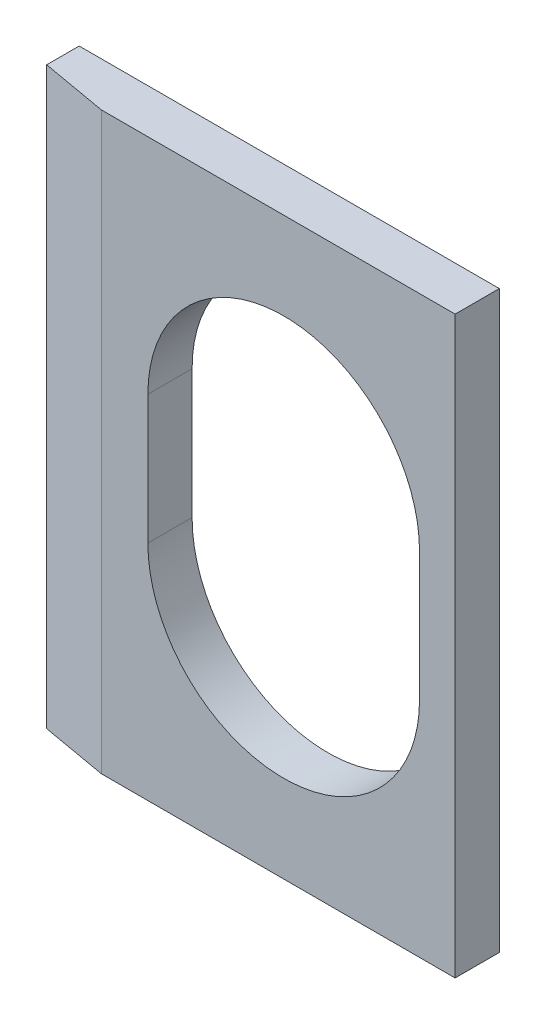
ISO-10303-21;
HEADER;
FILE_DESCRIPTION(('STEP AP214'),'2;1');
FILE_NAME('part.step','',(''),(''),'','','');
FILE_SCHEMA(('AUTOMOTIVE_DESIGN { 1 0 10303 214 1 1 1 1 }'));
ENDSEC;
DATA;
#1=APPLICATION_CONTEXT('core data for automotive mechanical design processes');
#2=APPLICATION_PROTOCOL_DEFINITION('international standard','automotive_design',2000,#1);
#3=PRODUCT_CONTEXT('',#1,'mechanical');
#4=PRODUCT('Part','Part','',(#3));
#5=PRODUCT_RELATED_PRODUCT_CATEGORY('part','',(#4));
#6=PRODUCT_DEFINITION_FORMATION('','',#4);
#7=PRODUCT_DEFINITION_CONTEXT('part definition',#1,'design');
#8=PRODUCT_DEFINITION('design','',#6,#7);
#9=PRODUCT_DEFINITION_SHAPE('','',#8);
#10=(LENGTH_UNIT() NAMED_UNIT(*) SI_UNIT(.MILLI.,.METRE.));
#11=(NAMED_UNIT(*) PLANE_ANGLE_UNIT() SI_UNIT($,.RADIAN.));
#12=(NAMED_UNIT(*) SI_UNIT($,.STERADIAN.) SOLID_ANGLE_UNIT());
#13=UNCERTAINTY_MEASURE_WITH_UNIT(LENGTH_MEASURE(1.E-05),#10,'distance_accuracy_value','');
#14=(GEOMETRIC_REPRESENTATION_CONTEXT(3) GLOBAL_UNCERTAINTY_ASSIGNED_CONTEXT((#13)) GLOBAL_UNIT_ASSIGNED_CONTEXT((#10,
#11,#12)) REPRESENTATION_CONTEXT('',''));
#15=CARTESIAN_POINT('',(0.,0.,0.));
#16=DIRECTION('',(0.,0.,1.));
#17=DIRECTION('',(1.,0.,0.));
#18=AXIS2_PLACEMENT_3D('',#15,#16,#17);
#19=CARTESIAN_POINT('',(60.325,-82.55,12.7));
#20=DIRECTION('',(-1.,0.,0.));
#21=DIRECTION('',(0.,0.,1.));
#22=AXIS2_PLACEMENT_3D('',#19,#20,#21);
#23=PLANE('',#22);
#24=DIRECTION('',(0.,1.,0.));
#25=VECTOR('',#24,1.);
#26=CARTESIAN_POINT('',(60.325,-82.55,0.));
#27=LINE('',#26,#25);
#28=CARTESIAN_POINT('',(60.325,-82.55,0.));
#29=VERTEX_POINT('',#28);
#30=CARTESIAN_POINT('',(60.325,82.55,0.));
#31=VERTEX_POINT('',#30);
#32=EDGE_CURVE('E128',#29,#31,#27,.T.);
#33=ORIENTED_EDGE('',*,*,#32,.T.);
#34=DIRECTION('',(0.,0.,-1.));
#35=VECTOR('',#34,1.);
#36=CARTESIAN_POINT('',(60.325,82.55,12.7));
#37=LINE('',#36,#35);
#38=CARTESIAN_POINT('',(60.325,82.55,12.7));
#39=VERTEX_POINT('',#38);
#40=EDGE_CURVE('E11',#39,#31,#37,.T.);
#41=ORIENTED_EDGE('',*,*,#40,.F.);
#42=DIRECTION('',(0.,1.,0.));
#43=VECTOR('',#42,1.);
#44=CARTESIAN_POINT('',(60.325,-82.55,12.7));
#45=LINE('',#44,#43);
#46=CARTESIAN_POINT('',(60.325,-82.55,12.7));
#47=VERTEX_POINT('',#46);
#48=EDGE_CURVE('E118',#47,#39,#45,.T.);
#49=ORIENTED_EDGE('',*,*,#48,.F.);
#50=DIRECTION('',(0.,0.,-1.));
#51=VECTOR('',#50,1.);
#52=CARTESIAN_POINT('',(60.325,-82.55,12.7));
#53=LINE('',#52,#51);
#54=EDGE_CURVE('E122',#47,#29,#53,.T.);
#55=ORIENTED_EDGE('',*,*,#54,.T.);
#56=EDGE_LOOP('',(#33,#41,#49,#55));
#57=FACE_BOUND('',#56,.T.);
#58=ADVANCED_FACE('F31',(#57),#23,.F.);
#59=CARTESIAN_POINT('',(-60.325,82.55,12.7));
#60=DIRECTION('',(0.,-1.,0.));
#61=DIRECTION('',(0.,0.,-1.));
#62=AXIS2_PLACEMENT_3D('',#59,#60,#61);
#63=PLANE('',#62);
#64=DIRECTION('',(0.,0.,-1.));
#65=VECTOR('',#64,1.);
#66=CARTESIAN_POINT('',(-60.325,82.55,12.7));
#67=LINE('',#66,#65);
#68=CARTESIAN_POINT('',(-60.325,82.55,9.34118215504656));
#69=VERTEX_POINT('',#68);
#70=CARTESIAN_POINT('',(-60.325,82.55,0.));
#71=VERTEX_POINT('',#70);
#72=EDGE_CURVE('E38',#69,#71,#67,.T.);
#73=ORIENTED_EDGE('',*,*,#72,.F.);
#74=DIRECTION('',(-0.984807753012209,0.,-0.173648177666923));
#75=VECTOR('',#74,1.);
#76=CARTESIAN_POINT('',(-41.2761974205072,82.55,12.7));
#77=LINE('',#76,#75);
#78=CARTESIAN_POINT('',(-41.2761974205072,82.55,12.7));
#79=VERTEX_POINT('',#78);
#80=EDGE_CURVE('E102',#79,#69,#77,.T.);
#81=ORIENTED_EDGE('',*,*,#80,.F.);
#82=DIRECTION('',(-1.,0.,0.));
#83=VECTOR('',#82,1.);
#84=CARTESIAN_POINT('',(-60.325,82.55,12.7));
#85=LINE('',#84,#83);
#86=EDGE_CURVE('E112',#39,#79,#85,.T.);
#87=ORIENTED_EDGE('',*,*,#86,.F.);
#88=ORIENTED_EDGE('',*,*,#40,.T.);
#89=DIRECTION('',(-1.,0.,0.));
#90=VECTOR('',#89,1.);
#91=CARTESIAN_POINT('',(-60.325,82.55,0.));
#92=LINE('',#91,#90);
#93=EDGE_CURVE('E131',#31,#71,#92,.T.);
#94=ORIENTED_EDGE('',*,*,#93,.T.);
#95=EDGE_LOOP('',(#73,#81,#87,#88,#94));
#96=FACE_BOUND('',#95,.T.);
#97=ADVANCED_FACE('F111',(#96),#63,.F.);
#98=CARTESIAN_POINT('',(-60.325,-82.55,12.7));
#99=DIRECTION('',(1.,0.,0.));
#100=DIRECTION('',(0.,0.,-1.));
#101=AXIS2_PLACEMENT_3D('',#98,#99,#100);
#102=PLANE('',#101);
#103=DIRECTION('',(0.,0.,-1.));
#104=VECTOR('',#103,1.);
#105=CARTESIAN_POINT('',(-60.325,-82.55,12.7));
#106=LINE('',#105,#104);
#107=CARTESIAN_POINT('',(-60.325,-82.55,9.34118215504656));
#108=VERTEX_POINT('',#107);
#109=CARTESIAN_POINT('',(-60.325,-82.55,0.));
#110=VERTEX_POINT('',#109);
#111=EDGE_CURVE('E140',#108,#110,#106,.T.);
#112=ORIENTED_EDGE('',*,*,#111,.F.);
#113=DIRECTION('',(0.,1.,0.));
#114=VECTOR('',#113,1.);
#115=CARTESIAN_POINT('',(-60.325,-82.551,9.34118215504656));
#116=LINE('',#115,#114);
#117=EDGE_CURVE('E107',#108,#69,#116,.T.);
#118=ORIENTED_EDGE('',*,*,#117,.T.);
#119=ORIENTED_EDGE('',*,*,#72,.T.);
#120=DIRECTION('',(0.,-1.,0.));
#121=VECTOR('',#120,1.);
#122=CARTESIAN_POINT('',(-60.325,-82.55,0.));
#123=LINE('',#122,#121);
#124=EDGE_CURVE('E134',#71,#110,#123,.T.);
#125=ORIENTED_EDGE('',*,*,#124,.T.);
#126=EDGE_LOOP('',(#112,#118,#119,#125));
#127=FACE_BOUND('',#126,.T.);
#128=ADVANCED_FACE('F143',(#127),#102,.F.);
#129=CARTESIAN_POINT('',(-60.325,-82.55,12.7));
#130=DIRECTION('',(0.,1.,0.));
#131=DIRECTION('',(0.,0.,1.));
#132=AXIS2_PLACEMENT_3D('',#129,#130,#131);
#133=PLANE('',#132);
#134=DIRECTION('',(1.,0.,0.));
#135=VECTOR('',#134,1.);
#136=CARTESIAN_POINT('',(-60.325,-82.55,12.7));
#137=LINE('',#136,#135);
#138=CARTESIAN_POINT('',(-41.2761974205073,-82.55,12.7));
#139=VERTEX_POINT('',#138);
#140=EDGE_CURVE('E120',#139,#47,#137,.T.);
#141=ORIENTED_EDGE('',*,*,#140,.F.);
#142=DIRECTION('',(0.984807753012209,0.,0.173648177666923));
#143=VECTOR('',#142,1.);
#144=CARTESIAN_POINT('',(-41.2761974205072,-82.55,12.7));
#145=LINE('',#144,#143);
#146=EDGE_CURVE('E45',#108,#139,#145,.T.);
#147=ORIENTED_EDGE('',*,*,#146,.F.);
#148=ORIENTED_EDGE('',*,*,#111,.T.);
#149=DIRECTION('',(1.,0.,0.));
#150=VECTOR('',#149,1.);
#151=CARTESIAN_POINT('',(-60.325,-82.55,0.));
#152=LINE('',#151,#150);
#153=EDGE_CURVE('E124',#110,#29,#152,.T.);
#154=ORIENTED_EDGE('',*,*,#153,.T.);
#155=ORIENTED_EDGE('',*,*,#54,.F.);
#156=EDGE_LOOP('',(#141,#147,#148,#154,#155));
#157=FACE_BOUND('',#156,.T.);
#158=ADVANCED_FACE('F151',(#157),#133,.F.);
#159=CARTESIAN_POINT('',(60.325,82.55,12.7));
#160=DIRECTION('',(0.,0.,-1.));
#161=DIRECTION('',(-1.,0.,0.));
#162=AXIS2_PLACEMENT_3D('',#159,#160,#161);
#163=PLANE('',#162);
#164=DIRECTION('',(0.,-1.,0.));
#165=VECTOR('',#164,1.);
#166=CARTESIAN_POINT('',(-27.9019,18.5039,12.7));
#167=LINE('',#166,#165);
#168=CARTESIAN_POINT('',(-27.9019,18.5039,12.7));
#169=VERTEX_POINT('',#168);
#170=CARTESIAN_POINT('',(-27.9019,-18.5039,12.7));
#171=VERTEX_POINT('',#170);
#172=EDGE_CURVE('E266',#169,#171,#167,.T.);
#173=ORIENTED_EDGE('',*,*,#172,.F.);
#174=CARTESIAN_POINT('',(11.0998,18.5039,12.7));
#175=DIRECTION('',(0.,0.,1.));
#176=DIRECTION('',(1.,0.,0.));
#177=AXIS2_PLACEMENT_3D('',#174,#175,#176);
#178=CIRCLE('',#177,39.0017);
#179=CARTESIAN_POINT('',(50.1015,18.5039,12.7));
#180=VERTEX_POINT('',#179);
#181=EDGE_CURVE('E53',#180,#169,#178,.T.);
#182=ORIENTED_EDGE('',*,*,#181,.F.);
#183=DIRECTION('',(0.,1.,0.));
#184=VECTOR('',#183,1.);
#185=CARTESIAN_POINT('',(50.1015,18.5039,12.7));
#186=LINE('',#185,#184);
#187=CARTESIAN_POINT('',(50.1015,-18.5039,12.7));
#188=VERTEX_POINT('',#187);
#189=EDGE_CURVE('E254',#188,#180,#186,.T.);
#190=ORIENTED_EDGE('',*,*,#189,.F.);
#191=CARTESIAN_POINT('',(11.0998,-18.5039,12.7));
#192=DIRECTION('',(0.,0.,1.));
#193=DIRECTION('',(1.,0.,0.));
#194=AXIS2_PLACEMENT_3D('',#191,#192,#193);
#195=CIRCLE('',#194,39.0017);
#196=EDGE_CURVE('E263',#171,#188,#195,.T.);
#197=ORIENTED_EDGE('',*,*,#196,.F.);
#198=EDGE_LOOP('',(#173,#182,#190,#197));
#199=FACE_BOUND('',#198,.T.);
#200=ORIENTED_EDGE('',*,*,#86,.T.);
#201=DIRECTION('',(0.,1.,0.));
#202=VECTOR('',#201,1.);
#203=CARTESIAN_POINT('',(-41.2761974205072,-82.551,12.7));
#204=LINE('',#203,#202);
#205=EDGE_CURVE('E99',#139,#79,#204,.T.);
#206=ORIENTED_EDGE('',*,*,#205,.F.);
#207=ORIENTED_EDGE('',*,*,#140,.T.);
#208=ORIENTED_EDGE('',*,*,#48,.T.);
#209=EDGE_LOOP('',(#200,#206,#207,#208));
#210=FACE_BOUND('',#209,.T.);
#211=ADVANCED_FACE('F116',(#199,#210),#163,.F.);
#212=CARTESIAN_POINT('',(60.325,82.55,0.));
#213=DIRECTION('',(0.,0.,-1.));
#214=DIRECTION('',(-1.,0.,0.));
#215=AXIS2_PLACEMENT_3D('',#212,#213,#214);
#216=PLANE('',#215);
#217=CARTESIAN_POINT('',(11.0998,18.5039,0.));
#218=DIRECTION('',(0.,0.,-1.));
#219=DIRECTION('',(-1.,0.,0.));
#220=AXIS2_PLACEMENT_3D('',#217,#218,#219);
#221=CIRCLE('',#220,39.0017);
#222=CARTESIAN_POINT('',(50.1015,18.5039,0.));
#223=VERTEX_POINT('',#222);
#224=CARTESIAN_POINT('',(-27.9019,18.5039,0.));
#225=VERTEX_POINT('',#224);
#226=EDGE_CURVE('E277',#223,#225,#221,.F.);
#227=ORIENTED_EDGE('',*,*,#226,.T.);
#228=DIRECTION('',(0.,-1.,0.));
#229=VECTOR('',#228,1.);
#230=CARTESIAN_POINT('',(-27.9019,18.5039,0.));
#231=LINE('',#230,#229);
#232=CARTESIAN_POINT('',(-27.9019,-18.5039,0.));
#233=VERTEX_POINT('',#232);
#234=EDGE_CURVE('E132',#225,#233,#231,.T.);
#235=ORIENTED_EDGE('',*,*,#234,.T.);
#236=CARTESIAN_POINT('',(11.0998,-18.5039,0.));
#237=DIRECTION('',(0.,0.,-1.));
#238=DIRECTION('',(-1.,0.,0.));
#239=AXIS2_PLACEMENT_3D('',#236,#237,#238);
#240=CIRCLE('',#239,39.0017);
#241=CARTESIAN_POINT('',(50.1015,-18.5039,0.));
#242=VERTEX_POINT('',#241);
#243=EDGE_CURVE('E276',#233,#242,#240,.F.);
#244=ORIENTED_EDGE('',*,*,#243,.T.);
#245=DIRECTION('',(0.,1.,0.));
#246=VECTOR('',#245,1.);
#247=CARTESIAN_POINT('',(50.1015,18.5039,0.));
#248=LINE('',#247,#246);
#249=EDGE_CURVE('E256',#242,#223,#248,.T.);
#250=ORIENTED_EDGE('',*,*,#249,.T.);
#251=EDGE_LOOP('',(#227,#235,#244,#250));
#252=FACE_BOUND('',#251,.T.);
#253=ORIENTED_EDGE('',*,*,#32,.F.);
#254=ORIENTED_EDGE('',*,*,#153,.F.);
#255=ORIENTED_EDGE('',*,*,#124,.F.);
#256=ORIENTED_EDGE('',*,*,#93,.F.);
#257=EDGE_LOOP('',(#253,#254,#255,#256));
#258=FACE_BOUND('',#257,.T.);
#259=ADVANCED_FACE('F148',(#252,#258),#216,.T.);
#260=CARTESIAN_POINT('',(11.0998,18.5039,-0.000999999999999265));
#261=DIRECTION('',(0.,0.,1.));
#262=DIRECTION('',(1.,0.,0.));
#263=AXIS2_PLACEMENT_3D('',#260,#261,#262);
#264=CYLINDRICAL_SURFACE('',#263,39.0017);
#265=DIRECTION('',(0.,0.,1.));
#266=VECTOR('',#265,1.);
#267=CARTESIAN_POINT('',(50.1015,18.5039,-0.000999999999999265));
#268=LINE('',#267,#266);
#269=EDGE_CURVE('E259',#223,#180,#268,.T.);
#270=ORIENTED_EDGE('',*,*,#269,.T.);
#271=ORIENTED_EDGE('',*,*,#181,.T.);
#272=DIRECTION('',(0.,0.,1.));
#273=VECTOR('',#272,1.);
#274=CARTESIAN_POINT('',(-27.9019,18.5039,-0.000999999999999265));
#275=LINE('',#274,#273);
#276=EDGE_CURVE('E268',#225,#169,#275,.T.);
#277=ORIENTED_EDGE('',*,*,#276,.F.);
#278=ORIENTED_EDGE('',*,*,#226,.F.);
#279=EDGE_LOOP('',(#270,#271,#277,#278));
#280=FACE_BOUND('',#279,.T.);
#281=ADVANCED_FACE('F166',(#280),#264,.F.);
#282=CARTESIAN_POINT('',(50.1015,18.5039,-0.000999999999999265));
#283=DIRECTION('',(1.,0.,0.));
#284=DIRECTION('',(0.,0.,-1.));
#285=AXIS2_PLACEMENT_3D('',#282,#283,#284);
#286=PLANE('',#285);
#287=DIRECTION('',(0.,0.,1.));
#288=VECTOR('',#287,1.);
#289=CARTESIAN_POINT('',(50.1015,-18.5039,-0.000999999999999265));
#290=LINE('',#289,#288);
#291=EDGE_CURVE('E250',#242,#188,#290,.T.);
#292=ORIENTED_EDGE('',*,*,#291,.T.);
#293=ORIENTED_EDGE('',*,*,#189,.T.);
#294=ORIENTED_EDGE('',*,*,#269,.F.);
#295=ORIENTED_EDGE('',*,*,#249,.F.);
#296=EDGE_LOOP('',(#292,#293,#294,#295));
#297=FACE_BOUND('',#296,.T.);
#298=ADVANCED_FACE('F173',(#297),#286,.F.);
#299=CARTESIAN_POINT('',(11.0998,-18.5039,-0.000999999999999265));
#300=DIRECTION('',(0.,0.,1.));
#301=DIRECTION('',(1.,0.,0.));
#302=AXIS2_PLACEMENT_3D('',#299,#300,#301);
#303=CYLINDRICAL_SURFACE('',#302,39.0017);
#304=DIRECTION('',(0.,0.,1.));
#305=VECTOR('',#304,1.);
#306=CARTESIAN_POINT('',(-27.9019,-18.5039,-0.000999999999999265));
#307=LINE('',#306,#305);
#308=EDGE_CURVE('E260',#233,#171,#307,.T.);
#309=ORIENTED_EDGE('',*,*,#308,.T.);
#310=ORIENTED_EDGE('',*,*,#196,.T.);
#311=ORIENTED_EDGE('',*,*,#291,.F.);
#312=ORIENTED_EDGE('',*,*,#243,.F.);
#313=EDGE_LOOP('',(#309,#310,#311,#312));
#314=FACE_BOUND('',#313,.T.);
#315=ADVANCED_FACE('F177',(#314),#303,.F.);
#316=CARTESIAN_POINT('',(-27.9019,18.5039,-0.000999999999999265));
#317=DIRECTION('',(-1.,0.,0.));
#318=DIRECTION('',(0.,0.,1.));
#319=AXIS2_PLACEMENT_3D('',#316,#317,#318);
#320=PLANE('',#319);
#321=ORIENTED_EDGE('',*,*,#276,.T.);
#322=ORIENTED_EDGE('',*,*,#172,.T.);
#323=ORIENTED_EDGE('',*,*,#308,.F.);
#324=ORIENTED_EDGE('',*,*,#234,.F.);
#325=EDGE_LOOP('',(#321,#322,#323,#324));
#326=FACE_BOUND('',#325,.T.);
#327=ADVANCED_FACE('F174',(#326),#320,.F.);
#328=CARTESIAN_POINT('',(-41.2761974205072,-82.551,12.7));
#329=DIRECTION('',(0.173648177666923,0.,-0.984807753012209));
#330=DIRECTION('',(-0.984807753012209,0.,-0.173648177666923));
#331=AXIS2_PLACEMENT_3D('',#328,#329,#330);
#332=PLANE('',#331);
#333=ORIENTED_EDGE('',*,*,#146,.T.);
#334=ORIENTED_EDGE('',*,*,#205,.T.);
#335=ORIENTED_EDGE('',*,*,#80,.T.);
#336=ORIENTED_EDGE('',*,*,#117,.F.);
#337=EDGE_LOOP('',(#333,#334,#335,#336));
#338=FACE_BOUND('',#337,.T.);
#339=ADVANCED_FACE('F101',(#338),#332,.F.);
#340=CLOSED_SHELL('',(#58,#97,#128,#158,#211,#259,#281,#298,#315,#327,#339));
#341=MANIFOLD_SOLID_BREP('B2',#340);
#342=ADVANCED_BREP_SHAPE_REPRESENTATION('',(#18,#341),#14);
#343=SHAPE_DEFINITION_REPRESENTATION(#9,#342);
ENDSEC;
END-ISO-10303-21;
